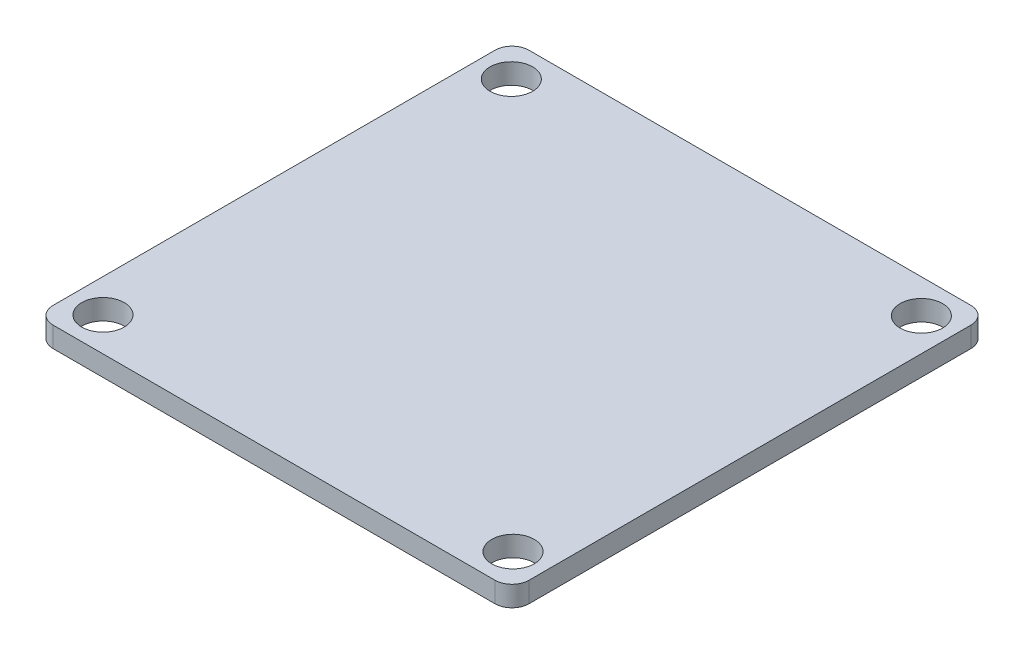
ISO-10303-21;
HEADER;
FILE_DESCRIPTION(('STEP AP214'),'2;1');
FILE_NAME('part.step','',(''),(''),'','','');
FILE_SCHEMA(('AUTOMOTIVE_DESIGN { 1 0 10303 214 1 1 1 1 }'));
ENDSEC;
DATA;
#1=APPLICATION_CONTEXT('core data for automotive mechanical design processes');
#2=APPLICATION_PROTOCOL_DEFINITION('international standard','automotive_design',2000,#1);
#3=PRODUCT_CONTEXT('',#1,'mechanical');
#4=PRODUCT('Part','Part','',(#3));
#5=PRODUCT_RELATED_PRODUCT_CATEGORY('part','',(#4));
#6=PRODUCT_DEFINITION_FORMATION('','',#4);
#7=PRODUCT_DEFINITION_CONTEXT('part definition',#1,'design');
#8=PRODUCT_DEFINITION('design','',#6,#7);
#9=PRODUCT_DEFINITION_SHAPE('','',#8);
#10=(LENGTH_UNIT() NAMED_UNIT(*) SI_UNIT(.MILLI.,.METRE.));
#11=(NAMED_UNIT(*) PLANE_ANGLE_UNIT() SI_UNIT($,.RADIAN.));
#12=(NAMED_UNIT(*) SI_UNIT($,.STERADIAN.) SOLID_ANGLE_UNIT());
#13=UNCERTAINTY_MEASURE_WITH_UNIT(LENGTH_MEASURE(1.E-05),#10,'distance_accuracy_value','');
#14=(GEOMETRIC_REPRESENTATION_CONTEXT(3) GLOBAL_UNCERTAINTY_ASSIGNED_CONTEXT((#13)) GLOBAL_UNIT_ASSIGNED_CONTEXT((#10,
#11,#12)) REPRESENTATION_CONTEXT('',''));
#15=CARTESIAN_POINT('',(0.,0.,0.));
#16=DIRECTION('',(0.,0.,1.));
#17=DIRECTION('',(1.,0.,0.));
#18=AXIS2_PLACEMENT_3D('',#15,#16,#17);
#19=CARTESIAN_POINT('',(-50.7461884856546,1.524,-34.157401308792));
#20=DIRECTION('',(0.,1.,0.));
#21=DIRECTION('',(0.,0.,1.));
#22=AXIS2_PLACEMENT_3D('',#19,#20,#21);
#23=PLANE('',#22);
#24=CARTESIAN_POINT('',(-18.9072884856546,1.524,-2.39470130879196));
#25=DIRECTION('',(0.,1.,0.));
#26=DIRECTION('',(0.,0.,-1.));
#27=AXIS2_PLACEMENT_3D('',#24,#25,#26);
#28=CIRCLE('',#27,1.5875);
#29=CARTESIAN_POINT('',(-18.9072884856546,1.524,-3.98220130879195));
#30=VERTEX_POINT('',#29);
#31=EDGE_CURVE('E188',#30,#30,#28,.T.);
#32=ORIENTED_EDGE('',*,*,#31,.F.);
#33=EDGE_LOOP('',(#32));
#34=FACE_BOUND('',#33,.T.);
#35=CARTESIAN_POINT('',(-49.5396884856546,1.524,-32.900101308792));
#36=DIRECTION('',(0.,1.,0.));
#37=DIRECTION('',(0.,0.,1.));
#38=AXIS2_PLACEMENT_3D('',#35,#36,#37);
#39=CIRCLE('',#38,1.5875);
#40=CARTESIAN_POINT('',(-49.5396884856546,1.524,-34.487601308792));
#41=VERTEX_POINT('',#40);
#42=EDGE_CURVE('E133',#41,#41,#39,.T.);
#43=ORIENTED_EDGE('',*,*,#42,.F.);
#44=EDGE_LOOP('',(#43));
#45=FACE_BOUND('',#44,.T.);
#46=CARTESIAN_POINT('',(-50.7461884856546,1.524,-34.157401308792));
#47=DIRECTION('',(0.,1.,0.));
#48=DIRECTION('',(0.,0.,1.));
#49=AXIS2_PLACEMENT_3D('',#46,#47,#48);
#50=CIRCLE('',#49,1.27);
#51=CARTESIAN_POINT('',(-50.7461884856546,1.524,-35.427401308792));
#52=VERTEX_POINT('',#51);
#53=CARTESIAN_POINT('',(-52.0161884856546,1.524,-34.1574013087919));
#54=VERTEX_POINT('',#53);
#55=EDGE_CURVE('E145',#52,#54,#50,.T.);
#56=ORIENTED_EDGE('',*,*,#55,.T.);
#57=DIRECTION('',(0.,0.,1.));
#58=VECTOR('',#57,1.);
#59=CARTESIAN_POINT('',(-52.0161884856546,1.524,-34.1574013087919));
#60=LINE('',#59,#58);
#61=CARTESIAN_POINT('',(-52.0161884856546,1.524,-1.13740130879197));
#62=VERTEX_POINT('',#61);
#63=EDGE_CURVE('E93',#54,#62,#60,.T.);
#64=ORIENTED_EDGE('',*,*,#63,.T.);
#65=CARTESIAN_POINT('',(-50.7461884856546,1.524,-1.13740130879196));
#66=DIRECTION('',(0.,1.,0.));
#67=DIRECTION('',(0.,0.,1.));
#68=AXIS2_PLACEMENT_3D('',#65,#66,#67);
#69=CIRCLE('',#68,1.27);
#70=CARTESIAN_POINT('',(-50.7461884856546,1.524,0.13259869120804));
#71=VERTEX_POINT('',#70);
#72=EDGE_CURVE('E160',#62,#71,#69,.T.);
#73=ORIENTED_EDGE('',*,*,#72,.T.);
#74=DIRECTION('',(1.,0.,0.));
#75=VECTOR('',#74,1.);
#76=CARTESIAN_POINT('',(-50.7461884856546,1.524,0.13259869120804));
#77=LINE('',#76,#75);
#78=CARTESIAN_POINT('',(-17.7261884856546,1.524,0.13259869120804));
#79=VERTEX_POINT('',#78);
#80=EDGE_CURVE('E173',#71,#79,#77,.T.);
#81=ORIENTED_EDGE('',*,*,#80,.T.);
#82=CARTESIAN_POINT('',(-17.7261884856546,1.524,-1.13740130879196));
#83=DIRECTION('',(0.,1.,0.));
#84=DIRECTION('',(0.,0.,1.));
#85=AXIS2_PLACEMENT_3D('',#82,#83,#84);
#86=CIRCLE('',#85,1.27);
#87=CARTESIAN_POINT('',(-16.4561884856546,1.524,-1.13740130879197));
#88=VERTEX_POINT('',#87);
#89=EDGE_CURVE('E112',#79,#88,#86,.T.);
#90=ORIENTED_EDGE('',*,*,#89,.T.);
#91=DIRECTION('',(0.,0.,-1.));
#92=VECTOR('',#91,1.);
#93=CARTESIAN_POINT('',(-16.4561884856546,1.524,-1.13740130879197));
#94=LINE('',#93,#92);
#95=CARTESIAN_POINT('',(-16.4561884856546,1.524,-34.1574013087919));
#96=VERTEX_POINT('',#95);
#97=EDGE_CURVE('E106',#88,#96,#94,.T.);
#98=ORIENTED_EDGE('',*,*,#97,.T.);
#99=CARTESIAN_POINT('',(-17.7261884856546,1.524,-34.157401308792));
#100=DIRECTION('',(0.,1.,0.));
#101=DIRECTION('',(0.,0.,-1.));
#102=AXIS2_PLACEMENT_3D('',#99,#100,#101);
#103=CIRCLE('',#102,1.27);
#104=CARTESIAN_POINT('',(-17.7261884856546,1.524,-35.427401308792));
#105=VERTEX_POINT('',#104);
#106=EDGE_CURVE('E110',#96,#105,#103,.T.);
#107=ORIENTED_EDGE('',*,*,#106,.T.);
#108=DIRECTION('',(-1.,0.,0.));
#109=VECTOR('',#108,1.);
#110=CARTESIAN_POINT('',(-50.7461884856546,1.524,-35.427401308792));
#111=LINE('',#110,#109);
#112=EDGE_CURVE('E50',#105,#52,#111,.T.);
#113=ORIENTED_EDGE('',*,*,#112,.T.);
#114=EDGE_LOOP('',(#56,#64,#73,#81,#90,#98,#107,#113));
#115=FACE_BOUND('',#114,.T.);
#116=CARTESIAN_POINT('',(-18.9072884856546,1.524,-32.900101308792));
#117=DIRECTION('',(0.,1.,0.));
#118=DIRECTION('',(0.,0.,1.));
#119=AXIS2_PLACEMENT_3D('',#116,#117,#118);
#120=CIRCLE('',#119,1.5875);
#121=CARTESIAN_POINT('',(-18.9072884856546,1.524,-34.487601308792));
#122=VERTEX_POINT('',#121);
#123=EDGE_CURVE('E182',#122,#122,#120,.T.);
#124=ORIENTED_EDGE('',*,*,#123,.F.);
#125=EDGE_LOOP('',(#124));
#126=FACE_BOUND('',#125,.T.);
#127=CARTESIAN_POINT('',(-49.5396884856546,1.524,-2.39470130879196));
#128=DIRECTION('',(0.,1.,0.));
#129=DIRECTION('',(0.,0.,-1.));
#130=AXIS2_PLACEMENT_3D('',#127,#128,#129);
#131=CIRCLE('',#130,1.5875);
#132=CARTESIAN_POINT('',(-49.5396884856546,1.524,-3.98220130879195));
#133=VERTEX_POINT('',#132);
#134=EDGE_CURVE('E194',#133,#133,#131,.T.);
#135=ORIENTED_EDGE('',*,*,#134,.F.);
#136=EDGE_LOOP('',(#135));
#137=FACE_BOUND('',#136,.T.);
#138=ADVANCED_FACE('F33',(#34,#45,#115,#126,#137),#23,.T.);
#139=CARTESIAN_POINT('',(-50.7461884856546,0.,-34.157401308792));
#140=DIRECTION('',(0.,1.,0.));
#141=DIRECTION('',(0.,0.,1.));
#142=AXIS2_PLACEMENT_3D('',#139,#140,#141);
#143=PLANE('',#142);
#144=CARTESIAN_POINT('',(-50.7461884856546,0.,-34.157401308792));
#145=DIRECTION('',(0.,1.,0.));
#146=DIRECTION('',(0.,0.,1.));
#147=AXIS2_PLACEMENT_3D('',#144,#145,#146);
#148=CIRCLE('',#147,1.27);
#149=CARTESIAN_POINT('',(-50.7461884856546,0.,-35.427401308792));
#150=VERTEX_POINT('',#149);
#151=CARTESIAN_POINT('',(-52.0161884856546,0.,-34.1574013087919));
#152=VERTEX_POINT('',#151);
#153=EDGE_CURVE('E129',#150,#152,#148,.T.);
#154=ORIENTED_EDGE('',*,*,#153,.F.);
#155=DIRECTION('',(-1.,0.,0.));
#156=VECTOR('',#155,1.);
#157=CARTESIAN_POINT('',(-50.7461884856546,0.,-35.427401308792));
#158=LINE('',#157,#156);
#159=CARTESIAN_POINT('',(-17.7261884856546,0.,-35.427401308792));
#160=VERTEX_POINT('',#159);
#161=EDGE_CURVE('E85',#160,#150,#158,.T.);
#162=ORIENTED_EDGE('',*,*,#161,.F.);
#163=CARTESIAN_POINT('',(-17.7261884856546,0.,-34.157401308792));
#164=DIRECTION('',(0.,1.,0.));
#165=DIRECTION('',(0.,0.,-1.));
#166=AXIS2_PLACEMENT_3D('',#163,#164,#165);
#167=CIRCLE('',#166,1.27);
#168=CARTESIAN_POINT('',(-16.4561884856546,0.,-34.1574013087919));
#169=VERTEX_POINT('',#168);
#170=EDGE_CURVE('E79',#169,#160,#167,.T.);
#171=ORIENTED_EDGE('',*,*,#170,.F.);
#172=DIRECTION('',(0.,0.,-1.));
#173=VECTOR('',#172,1.);
#174=CARTESIAN_POINT('',(-16.4561884856546,0.,-27.108901308792));
#175=LINE('',#174,#173);
#176=CARTESIAN_POINT('',(-16.4561884856546,0.,-1.13740130879197));
#177=VERTEX_POINT('',#176);
#178=EDGE_CURVE('E119',#177,#169,#175,.T.);
#179=ORIENTED_EDGE('',*,*,#178,.F.);
#180=CARTESIAN_POINT('',(-17.7261884856546,0.,-1.13740130879196));
#181=DIRECTION('',(0.,1.,0.));
#182=DIRECTION('',(0.,0.,1.));
#183=AXIS2_PLACEMENT_3D('',#180,#181,#182);
#184=CIRCLE('',#183,1.27);
#185=CARTESIAN_POINT('',(-17.7261884856546,0.,0.13259869120804));
#186=VERTEX_POINT('',#185);
#187=EDGE_CURVE('E139',#186,#177,#184,.T.);
#188=ORIENTED_EDGE('',*,*,#187,.F.);
#189=DIRECTION('',(1.,0.,0.));
#190=VECTOR('',#189,1.);
#191=CARTESIAN_POINT('',(-50.7461884856546,0.,0.13259869120804));
#192=LINE('',#191,#190);
#193=CARTESIAN_POINT('',(-50.7461884856546,0.,0.13259869120804));
#194=VERTEX_POINT('',#193);
#195=EDGE_CURVE('E137',#194,#186,#192,.T.);
#196=ORIENTED_EDGE('',*,*,#195,.F.);
#197=CARTESIAN_POINT('',(-50.7461884856546,0.,-1.13740130879196));
#198=DIRECTION('',(0.,1.,0.));
#199=DIRECTION('',(0.,0.,1.));
#200=AXIS2_PLACEMENT_3D('',#197,#198,#199);
#201=CIRCLE('',#200,1.27);
#202=CARTESIAN_POINT('',(-52.0161884856546,0.,-1.13740130879197));
#203=VERTEX_POINT('',#202);
#204=EDGE_CURVE('E135',#203,#194,#201,.T.);
#205=ORIENTED_EDGE('',*,*,#204,.F.);
#206=DIRECTION('',(0.,0.,1.));
#207=VECTOR('',#206,1.);
#208=CARTESIAN_POINT('',(-52.0161884856546,0.,-34.1574013087919));
#209=LINE('',#208,#207);
#210=EDGE_CURVE('E132',#152,#203,#209,.T.);
#211=ORIENTED_EDGE('',*,*,#210,.F.);
#212=EDGE_LOOP('',(#154,#162,#171,#179,#188,#196,#205,#211));
#213=FACE_BOUND('',#212,.T.);
#214=CARTESIAN_POINT('',(-49.5396884856546,0.,-32.900101308792));
#215=DIRECTION('',(0.,1.,0.));
#216=DIRECTION('',(0.,0.,1.));
#217=AXIS2_PLACEMENT_3D('',#214,#215,#216);
#218=CIRCLE('',#217,1.5875);
#219=CARTESIAN_POINT('',(-49.5396884856546,0.,-34.487601308792));
#220=VERTEX_POINT('',#219);
#221=EDGE_CURVE('E179',#220,#220,#218,.T.);
#222=ORIENTED_EDGE('',*,*,#221,.T.);
#223=EDGE_LOOP('',(#222));
#224=FACE_BOUND('',#223,.T.);
#225=CARTESIAN_POINT('',(-18.9072884856546,0.,-32.900101308792));
#226=DIRECTION('',(0.,1.,0.));
#227=DIRECTION('',(0.,0.,1.));
#228=AXIS2_PLACEMENT_3D('',#225,#226,#227);
#229=CIRCLE('',#228,1.5875);
#230=CARTESIAN_POINT('',(-18.9072884856546,0.,-34.487601308792));
#231=VERTEX_POINT('',#230);
#232=EDGE_CURVE('E185',#231,#231,#229,.T.);
#233=ORIENTED_EDGE('',*,*,#232,.T.);
#234=EDGE_LOOP('',(#233));
#235=FACE_BOUND('',#234,.T.);
#236=CARTESIAN_POINT('',(-18.9072884856546,0.,-2.39470130879196));
#237=DIRECTION('',(0.,1.,0.));
#238=DIRECTION('',(0.,0.,-1.));
#239=AXIS2_PLACEMENT_3D('',#236,#237,#238);
#240=CIRCLE('',#239,1.5875);
#241=CARTESIAN_POINT('',(-18.9072884856546,0.,-3.98220130879195));
#242=VERTEX_POINT('',#241);
#243=EDGE_CURVE('E191',#242,#242,#240,.T.);
#244=ORIENTED_EDGE('',*,*,#243,.T.);
#245=EDGE_LOOP('',(#244));
#246=FACE_BOUND('',#245,.T.);
#247=CARTESIAN_POINT('',(-49.5396884856546,0.,-2.39470130879196));
#248=DIRECTION('',(0.,1.,0.));
#249=DIRECTION('',(0.,0.,-1.));
#250=AXIS2_PLACEMENT_3D('',#247,#248,#249);
#251=CIRCLE('',#250,1.5875);
#252=CARTESIAN_POINT('',(-49.5396884856546,0.,-3.98220130879195));
#253=VERTEX_POINT('',#252);
#254=EDGE_CURVE('E197',#253,#253,#251,.T.);
#255=ORIENTED_EDGE('',*,*,#254,.T.);
#256=EDGE_LOOP('',(#255));
#257=FACE_BOUND('',#256,.T.);
#258=ADVANCED_FACE('F164',(#213,#224,#235,#246,#257),#143,.F.);
#259=CARTESIAN_POINT('',(-50.7461884856546,1.524,-34.157401308792));
#260=DIRECTION('',(0.,-1.,0.));
#261=DIRECTION('',(0.,0.,-1.));
#262=AXIS2_PLACEMENT_3D('',#259,#260,#261);
#263=CYLINDRICAL_SURFACE('',#262,1.27);
#264=ORIENTED_EDGE('',*,*,#153,.T.);
#265=DIRECTION('',(0.,-1.,0.));
#266=VECTOR('',#265,1.);
#267=CARTESIAN_POINT('',(-52.0161884856546,1.524,-34.1574013087919));
#268=LINE('',#267,#266);
#269=EDGE_CURVE('E11',#54,#152,#268,.T.);
#270=ORIENTED_EDGE('',*,*,#269,.F.);
#271=ORIENTED_EDGE('',*,*,#55,.F.);
#272=DIRECTION('',(0.,-1.,0.));
#273=VECTOR('',#272,1.);
#274=CARTESIAN_POINT('',(-50.7461884856546,1.524,-35.427401308792));
#275=LINE('',#274,#273);
#276=EDGE_CURVE('E125',#52,#150,#275,.T.);
#277=ORIENTED_EDGE('',*,*,#276,.T.);
#278=EDGE_LOOP('',(#264,#270,#271,#277));
#279=FACE_BOUND('',#278,.T.);
#280=ADVANCED_FACE('F35',(#279),#263,.T.);
#281=CARTESIAN_POINT('',(-52.0161884856546,1.524,-34.1574013087919));
#282=DIRECTION('',(1.,0.,0.));
#283=DIRECTION('',(0.,0.,-1.));
#284=AXIS2_PLACEMENT_3D('',#281,#282,#283);
#285=PLANE('',#284);
#286=ORIENTED_EDGE('',*,*,#210,.T.);
#287=DIRECTION('',(0.,-1.,0.));
#288=VECTOR('',#287,1.);
#289=CARTESIAN_POINT('',(-52.0161884856546,1.524,-1.13740130879197));
#290=LINE('',#289,#288);
#291=EDGE_CURVE('E42',#62,#203,#290,.T.);
#292=ORIENTED_EDGE('',*,*,#291,.F.);
#293=ORIENTED_EDGE('',*,*,#63,.F.);
#294=ORIENTED_EDGE('',*,*,#269,.T.);
#295=EDGE_LOOP('',(#286,#292,#293,#294));
#296=FACE_BOUND('',#295,.T.);
#297=ADVANCED_FACE('F231',(#296),#285,.F.);
#298=CARTESIAN_POINT('',(-50.7461884856546,1.524,-1.13740130879196));
#299=DIRECTION('',(0.,-1.,0.));
#300=DIRECTION('',(0.,0.,-1.));
#301=AXIS2_PLACEMENT_3D('',#298,#299,#300);
#302=CYLINDRICAL_SURFACE('',#301,1.27);
#303=ORIENTED_EDGE('',*,*,#204,.T.);
#304=DIRECTION('',(0.,-1.,0.));
#305=VECTOR('',#304,1.);
#306=CARTESIAN_POINT('',(-50.7461884856546,1.524,0.13259869120804));
#307=LINE('',#306,#305);
#308=EDGE_CURVE('E152',#71,#194,#307,.T.);
#309=ORIENTED_EDGE('',*,*,#308,.F.);
#310=ORIENTED_EDGE('',*,*,#72,.F.);
#311=ORIENTED_EDGE('',*,*,#291,.T.);
#312=EDGE_LOOP('',(#303,#309,#310,#311));
#313=FACE_BOUND('',#312,.T.);
#314=ADVANCED_FACE('F158',(#313),#302,.T.);
#315=CARTESIAN_POINT('',(-50.7461884856546,1.524,0.13259869120804));
#316=DIRECTION('',(0.,0.,-1.));
#317=DIRECTION('',(-1.,0.,0.));
#318=AXIS2_PLACEMENT_3D('',#315,#316,#317);
#319=PLANE('',#318);
#320=ORIENTED_EDGE('',*,*,#195,.T.);
#321=DIRECTION('',(0.,-1.,0.));
#322=VECTOR('',#321,1.);
#323=CARTESIAN_POINT('',(-17.7261884856546,1.524,0.13259869120804));
#324=LINE('',#323,#322);
#325=EDGE_CURVE('E149',#79,#186,#324,.T.);
#326=ORIENTED_EDGE('',*,*,#325,.F.);
#327=ORIENTED_EDGE('',*,*,#80,.F.);
#328=ORIENTED_EDGE('',*,*,#308,.T.);
#329=EDGE_LOOP('',(#320,#326,#327,#328));
#330=FACE_BOUND('',#329,.T.);
#331=ADVANCED_FACE('F169',(#330),#319,.F.);
#332=CARTESIAN_POINT('',(-17.7261884856546,1.524,-1.13740130879196));
#333=DIRECTION('',(0.,-1.,0.));
#334=DIRECTION('',(0.,0.,-1.));
#335=AXIS2_PLACEMENT_3D('',#332,#333,#334);
#336=CYLINDRICAL_SURFACE('',#335,1.27);
#337=ORIENTED_EDGE('',*,*,#187,.T.);
#338=DIRECTION('',(0.,-1.,0.));
#339=VECTOR('',#338,1.);
#340=CARTESIAN_POINT('',(-16.4561884856546,1.524,-1.13740130879197));
#341=LINE('',#340,#339);
#342=EDGE_CURVE('E120',#88,#177,#341,.T.);
#343=ORIENTED_EDGE('',*,*,#342,.F.);
#344=ORIENTED_EDGE('',*,*,#89,.F.);
#345=ORIENTED_EDGE('',*,*,#325,.T.);
#346=EDGE_LOOP('',(#337,#343,#344,#345));
#347=FACE_BOUND('',#346,.T.);
#348=ADVANCED_FACE('F172',(#347),#336,.T.);
#349=CARTESIAN_POINT('',(-16.4561884856546,1.524,-27.108901308792));
#350=DIRECTION('',(-1.,0.,0.));
#351=DIRECTION('',(0.,0.,1.));
#352=AXIS2_PLACEMENT_3D('',#349,#350,#351);
#353=PLANE('',#352);
#354=ORIENTED_EDGE('',*,*,#178,.T.);
#355=DIRECTION('',(0.,-1.,0.));
#356=VECTOR('',#355,1.);
#357=CARTESIAN_POINT('',(-16.4561884856546,1.524,-34.1574013087919));
#358=LINE('',#357,#356);
#359=EDGE_CURVE('E117',#96,#169,#358,.T.);
#360=ORIENTED_EDGE('',*,*,#359,.F.);
#361=ORIENTED_EDGE('',*,*,#97,.F.);
#362=ORIENTED_EDGE('',*,*,#342,.T.);
#363=EDGE_LOOP('',(#354,#360,#361,#362));
#364=FACE_BOUND('',#363,.T.);
#365=ADVANCED_FACE('F118',(#364),#353,.F.);
#366=CARTESIAN_POINT('',(-17.7261884856546,1.524,-34.157401308792));
#367=DIRECTION('',(0.,-1.,0.));
#368=DIRECTION('',(0.,0.,-1.));
#369=AXIS2_PLACEMENT_3D('',#366,#367,#368);
#370=CYLINDRICAL_SURFACE('',#369,1.27);
#371=ORIENTED_EDGE('',*,*,#170,.T.);
#372=DIRECTION('',(0.,-1.,0.));
#373=VECTOR('',#372,1.);
#374=CARTESIAN_POINT('',(-17.7261884856546,1.524,-35.427401308792));
#375=LINE('',#374,#373);
#376=EDGE_CURVE('E121',#105,#160,#375,.T.);
#377=ORIENTED_EDGE('',*,*,#376,.F.);
#378=ORIENTED_EDGE('',*,*,#106,.F.);
#379=ORIENTED_EDGE('',*,*,#359,.T.);
#380=EDGE_LOOP('',(#371,#377,#378,#379));
#381=FACE_BOUND('',#380,.T.);
#382=ADVANCED_FACE('F123',(#381),#370,.T.);
#383=CARTESIAN_POINT('',(-50.7461884856546,1.524,-35.427401308792));
#384=DIRECTION('',(0.,0.,1.));
#385=DIRECTION('',(1.,0.,0.));
#386=AXIS2_PLACEMENT_3D('',#383,#384,#385);
#387=PLANE('',#386);
#388=ORIENTED_EDGE('',*,*,#161,.T.);
#389=ORIENTED_EDGE('',*,*,#276,.F.);
#390=ORIENTED_EDGE('',*,*,#112,.F.);
#391=ORIENTED_EDGE('',*,*,#376,.T.);
#392=EDGE_LOOP('',(#388,#389,#390,#391));
#393=FACE_BOUND('',#392,.T.);
#394=ADVANCED_FACE('F219',(#393),#387,.F.);
#395=CARTESIAN_POINT('',(-49.5396884856546,1.524,-32.900101308792));
#396=DIRECTION('',(0.,-1.,0.));
#397=DIRECTION('',(0.,0.,-1.));
#398=AXIS2_PLACEMENT_3D('',#395,#396,#397);
#399=CYLINDRICAL_SURFACE('',#398,1.5875);
#400=CARTESIAN_POINT('',(-49.5396884856546,1.524,-34.487601308792));
#401=CARTESIAN_POINT('',(-49.5396884856546,1.508125,-34.487601308792));
#402=CARTESIAN_POINT('',(-49.5396884856546,1.49225,-34.487601308792));
#403=CARTESIAN_POINT('',(-49.5396884856546,1.4605,-34.487601308792));
#404=CARTESIAN_POINT('',(-49.5396884856546,1.444625,-34.487601308792));
#405=CARTESIAN_POINT('',(-49.5396884856546,1.412875,-34.487601308792));
#406=CARTESIAN_POINT('',(-49.5396884856546,1.397,-34.487601308792));
#407=CARTESIAN_POINT('',(-49.5396884856546,1.36525,-34.487601308792));
#408=CARTESIAN_POINT('',(-49.5396884856546,1.349375,-34.487601308792));
#409=CARTESIAN_POINT('',(-49.5396884856546,1.317625,-34.487601308792));
#410=CARTESIAN_POINT('',(-49.5396884856546,1.30175,-34.487601308792));
#411=CARTESIAN_POINT('',(-49.5396884856546,1.27,-34.487601308792));
#412=CARTESIAN_POINT('',(-49.5396884856546,1.254125,-34.487601308792));
#413=CARTESIAN_POINT('',(-49.5396884856546,1.222375,-34.487601308792));
#414=CARTESIAN_POINT('',(-49.5396884856546,1.2065,-34.487601308792));
#415=CARTESIAN_POINT('',(-49.5396884856546,1.17475,-34.487601308792));
#416=CARTESIAN_POINT('',(-49.5396884856546,1.158875,-34.487601308792));
#417=CARTESIAN_POINT('',(-49.5396884856546,1.127125,-34.487601308792));
#418=CARTESIAN_POINT('',(-49.5396884856546,1.11125,-34.487601308792));
#419=CARTESIAN_POINT('',(-49.5396884856546,1.0795,-34.487601308792));
#420=CARTESIAN_POINT('',(-49.5396884856546,1.063625,-34.487601308792));
#421=CARTESIAN_POINT('',(-49.5396884856546,1.031875,-34.487601308792));
#422=CARTESIAN_POINT('',(-49.5396884856546,1.016,-34.487601308792));
#423=CARTESIAN_POINT('',(-49.5396884856546,0.98425,-34.487601308792));
#424=CARTESIAN_POINT('',(-49.5396884856546,0.968375,-34.487601308792));
#425=CARTESIAN_POINT('',(-49.5396884856546,0.936625,-34.487601308792));
#426=CARTESIAN_POINT('',(-49.5396884856546,0.92075,-34.487601308792));
#427=CARTESIAN_POINT('',(-49.5396884856546,0.889,-34.487601308792));
#428=CARTESIAN_POINT('',(-49.5396884856546,0.873125,-34.487601308792));
#429=CARTESIAN_POINT('',(-49.5396884856546,0.841375,-34.487601308792));
#430=CARTESIAN_POINT('',(-49.5396884856546,0.8255,-34.487601308792));
#431=CARTESIAN_POINT('',(-49.5396884856546,0.79375,-34.487601308792));
#432=CARTESIAN_POINT('',(-49.5396884856546,0.777875,-34.487601308792));
#433=CARTESIAN_POINT('',(-49.5396884856546,0.746125,-34.487601308792));
#434=CARTESIAN_POINT('',(-49.5396884856546,0.73025,-34.487601308792));
#435=CARTESIAN_POINT('',(-49.5396884856546,0.6985,-34.487601308792));
#436=CARTESIAN_POINT('',(-49.5396884856546,0.682625,-34.487601308792));
#437=CARTESIAN_POINT('',(-49.5396884856546,0.650875,-34.487601308792));
#438=CARTESIAN_POINT('',(-49.5396884856546,0.635,-34.487601308792));
#439=CARTESIAN_POINT('',(-49.5396884856546,0.60325,-34.487601308792));
#440=CARTESIAN_POINT('',(-49.5396884856546,0.587375,-34.487601308792));
#441=CARTESIAN_POINT('',(-49.5396884856546,0.555625,-34.487601308792));
#442=CARTESIAN_POINT('',(-49.5396884856546,0.53975,-34.487601308792));
#443=CARTESIAN_POINT('',(-49.5396884856546,0.508,-34.487601308792));
#444=CARTESIAN_POINT('',(-49.5396884856546,0.492125,-34.487601308792));
#445=CARTESIAN_POINT('',(-49.5396884856546,0.460375,-34.487601308792));
#446=CARTESIAN_POINT('',(-49.5396884856546,0.4445,-34.487601308792));
#447=CARTESIAN_POINT('',(-49.5396884856546,0.41275,-34.487601308792));
#448=CARTESIAN_POINT('',(-49.5396884856546,0.396875,-34.487601308792));
#449=CARTESIAN_POINT('',(-49.5396884856546,0.365125,-34.487601308792));
#450=CARTESIAN_POINT('',(-49.5396884856546,0.34925,-34.487601308792));
#451=CARTESIAN_POINT('',(-49.5396884856546,0.3175,-34.487601308792));
#452=CARTESIAN_POINT('',(-49.5396884856546,0.301625,-34.487601308792));
#453=CARTESIAN_POINT('',(-49.5396884856546,0.269875,-34.487601308792));
#454=CARTESIAN_POINT('',(-49.5396884856546,0.254,-34.487601308792));
#455=CARTESIAN_POINT('',(-49.5396884856546,0.22225,-34.487601308792));
#456=CARTESIAN_POINT('',(-49.5396884856546,0.206375,-34.487601308792));
#457=CARTESIAN_POINT('',(-49.5396884856546,0.174625,-34.487601308792));
#458=CARTESIAN_POINT('',(-49.5396884856546,0.15875,-34.487601308792));
#459=CARTESIAN_POINT('',(-49.5396884856546,0.127,-34.487601308792));
#460=CARTESIAN_POINT('',(-49.5396884856546,0.111125,-34.487601308792));
#461=CARTESIAN_POINT('',(-49.5396884856546,0.079375,-34.487601308792));
#462=CARTESIAN_POINT('',(-49.5396884856546,0.0635,-34.487601308792));
#463=CARTESIAN_POINT('',(-49.5396884856546,0.0317499999999999,-34.487601308792));
#464=CARTESIAN_POINT('',(-49.5396884856546,0.015875,-34.487601308792));
#465=CARTESIAN_POINT('',(-49.5396884856546,0.,-34.487601308792));
#466=B_SPLINE_CURVE_WITH_KNOTS('',3,(#400,#401,#402,#403,#404,#405,#406,#407,#408,#409,#410,
#411,#412,#413,#414,#415,#416,#417,#418,#419,#420,#421,#422,#423,#424,#425,#426,#427,#428,#429,
#430,#431,#432,#433,#434,#435,#436,#437,#438,#439,#440,#441,#442,#443,#444,#445,#446,#447,#448,
#449,#450,#451,#452,#453,#454,#455,#456,#457,#458,#459,#460,#461,#462,#463,#464,#465),
.UNSPECIFIED.,.F.,.F.,(4,2,2,2,2,2,2,2,2,2,2,2,2,2,2,2,2,2,2,2,2,2,2,2,2,2,2,2,2,2,2,2,4),(0.,
0.0476250000000001,0.0952500000000001,0.142875,0.1905,0.238125,0.28575,0.333375,0.381,0.428625,
0.47625,0.523875,0.5715,0.619125,0.66675,0.714375,0.762,0.809625,0.85725,0.904875,0.9525,
1.000125,1.04775,1.095375,1.143,1.190625,1.23825,1.285875,1.3335,1.381125,1.42875,1.476375,
1.524),.UNSPECIFIED.);
#467=EDGE_CURVE('BSEAM216',#41,#220,#466,.T.);
#468=ORIENTED_EDGE('',*,*,#42,.T.);
#469=ORIENTED_EDGE('',*,*,#221,.F.);
#470=ORIENTED_EDGE('',*,*,#467,.T.);
#471=ORIENTED_EDGE('',*,*,#467,.F.);
#472=EDGE_LOOP('',(#468,#470,#469,#471));
#473=FACE_BOUND('',#472,.T.);
#474=ADVANCED_FACE('F216',(#473),#399,.F.);
#475=CARTESIAN_POINT('',(-18.9072884856546,1.524,-32.900101308792));
#476=DIRECTION('',(0.,-1.,0.));
#477=DIRECTION('',(0.,0.,-1.));
#478=AXIS2_PLACEMENT_3D('',#475,#476,#477);
#479=CYLINDRICAL_SURFACE('',#478,1.5875);
#480=CARTESIAN_POINT('',(-18.9072884856546,1.524,-34.487601308792));
#481=CARTESIAN_POINT('',(-18.9072884856546,1.508125,-34.487601308792));
#482=CARTESIAN_POINT('',(-18.9072884856546,1.49225,-34.487601308792));
#483=CARTESIAN_POINT('',(-18.9072884856546,1.4605,-34.487601308792));
#484=CARTESIAN_POINT('',(-18.9072884856546,1.444625,-34.487601308792));
#485=CARTESIAN_POINT('',(-18.9072884856546,1.412875,-34.487601308792));
#486=CARTESIAN_POINT('',(-18.9072884856546,1.397,-34.487601308792));
#487=CARTESIAN_POINT('',(-18.9072884856546,1.36525,-34.487601308792));
#488=CARTESIAN_POINT('',(-18.9072884856546,1.349375,-34.487601308792));
#489=CARTESIAN_POINT('',(-18.9072884856546,1.317625,-34.487601308792));
#490=CARTESIAN_POINT('',(-18.9072884856546,1.30175,-34.487601308792));
#491=CARTESIAN_POINT('',(-18.9072884856546,1.27,-34.487601308792));
#492=CARTESIAN_POINT('',(-18.9072884856546,1.254125,-34.487601308792));
#493=CARTESIAN_POINT('',(-18.9072884856546,1.222375,-34.487601308792));
#494=CARTESIAN_POINT('',(-18.9072884856546,1.2065,-34.487601308792));
#495=CARTESIAN_POINT('',(-18.9072884856546,1.17475,-34.487601308792));
#496=CARTESIAN_POINT('',(-18.9072884856546,1.158875,-34.487601308792));
#497=CARTESIAN_POINT('',(-18.9072884856546,1.127125,-34.487601308792));
#498=CARTESIAN_POINT('',(-18.9072884856546,1.11125,-34.487601308792));
#499=CARTESIAN_POINT('',(-18.9072884856546,1.0795,-34.487601308792));
#500=CARTESIAN_POINT('',(-18.9072884856546,1.063625,-34.487601308792));
#501=CARTESIAN_POINT('',(-18.9072884856546,1.031875,-34.487601308792));
#502=CARTESIAN_POINT('',(-18.9072884856546,1.016,-34.487601308792));
#503=CARTESIAN_POINT('',(-18.9072884856546,0.98425,-34.487601308792));
#504=CARTESIAN_POINT('',(-18.9072884856546,0.968375,-34.487601308792));
#505=CARTESIAN_POINT('',(-18.9072884856546,0.936625,-34.487601308792));
#506=CARTESIAN_POINT('',(-18.9072884856546,0.92075,-34.487601308792));
#507=CARTESIAN_POINT('',(-18.9072884856546,0.889,-34.487601308792));
#508=CARTESIAN_POINT('',(-18.9072884856546,0.873125,-34.487601308792));
#509=CARTESIAN_POINT('',(-18.9072884856546,0.841375,-34.487601308792));
#510=CARTESIAN_POINT('',(-18.9072884856546,0.8255,-34.487601308792));
#511=CARTESIAN_POINT('',(-18.9072884856546,0.79375,-34.487601308792));
#512=CARTESIAN_POINT('',(-18.9072884856546,0.777875,-34.487601308792));
#513=CARTESIAN_POINT('',(-18.9072884856546,0.746125,-34.487601308792));
#514=CARTESIAN_POINT('',(-18.9072884856546,0.73025,-34.487601308792));
#515=CARTESIAN_POINT('',(-18.9072884856546,0.6985,-34.487601308792));
#516=CARTESIAN_POINT('',(-18.9072884856546,0.682625,-34.487601308792));
#517=CARTESIAN_POINT('',(-18.9072884856546,0.650875,-34.487601308792));
#518=CARTESIAN_POINT('',(-18.9072884856546,0.635,-34.487601308792));
#519=CARTESIAN_POINT('',(-18.9072884856546,0.60325,-34.487601308792));
#520=CARTESIAN_POINT('',(-18.9072884856546,0.587375,-34.487601308792));
#521=CARTESIAN_POINT('',(-18.9072884856546,0.555625,-34.487601308792));
#522=CARTESIAN_POINT('',(-18.9072884856546,0.53975,-34.487601308792));
#523=CARTESIAN_POINT('',(-18.9072884856546,0.508,-34.487601308792));
#524=CARTESIAN_POINT('',(-18.9072884856546,0.492125,-34.487601308792));
#525=CARTESIAN_POINT('',(-18.9072884856546,0.460375,-34.487601308792));
#526=CARTESIAN_POINT('',(-18.9072884856546,0.4445,-34.487601308792));
#527=CARTESIAN_POINT('',(-18.9072884856546,0.41275,-34.487601308792));
#528=CARTESIAN_POINT('',(-18.9072884856546,0.396875,-34.487601308792));
#529=CARTESIAN_POINT('',(-18.9072884856546,0.365125,-34.487601308792));
#530=CARTESIAN_POINT('',(-18.9072884856546,0.34925,-34.487601308792));
#531=CARTESIAN_POINT('',(-18.9072884856546,0.3175,-34.487601308792));
#532=CARTESIAN_POINT('',(-18.9072884856546,0.301625,-34.487601308792));
#533=CARTESIAN_POINT('',(-18.9072884856546,0.269875,-34.487601308792));
#534=CARTESIAN_POINT('',(-18.9072884856546,0.254,-34.487601308792));
#535=CARTESIAN_POINT('',(-18.9072884856546,0.22225,-34.487601308792));
#536=CARTESIAN_POINT('',(-18.9072884856546,0.206375,-34.487601308792));
#537=CARTESIAN_POINT('',(-18.9072884856546,0.174625,-34.487601308792));
#538=CARTESIAN_POINT('',(-18.9072884856546,0.15875,-34.487601308792));
#539=CARTESIAN_POINT('',(-18.9072884856546,0.127,-34.487601308792));
#540=CARTESIAN_POINT('',(-18.9072884856546,0.111125,-34.487601308792));
#541=CARTESIAN_POINT('',(-18.9072884856546,0.079375,-34.487601308792));
#542=CARTESIAN_POINT('',(-18.9072884856546,0.0635,-34.487601308792));
#543=CARTESIAN_POINT('',(-18.9072884856546,0.0317499999999999,-34.487601308792));
#544=CARTESIAN_POINT('',(-18.9072884856546,0.015875,-34.487601308792));
#545=CARTESIAN_POINT('',(-18.9072884856546,0.,-34.487601308792));
#546=B_SPLINE_CURVE_WITH_KNOTS('',3,(#480,#481,#482,#483,#484,#485,#486,#487,#488,#489,#490,
#491,#492,#493,#494,#495,#496,#497,#498,#499,#500,#501,#502,#503,#504,#505,#506,#507,#508,#509,
#510,#511,#512,#513,#514,#515,#516,#517,#518,#519,#520,#521,#522,#523,#524,#525,#526,#527,#528,
#529,#530,#531,#532,#533,#534,#535,#536,#537,#538,#539,#540,#541,#542,#543,#544,#545),
.UNSPECIFIED.,.F.,.F.,(4,2,2,2,2,2,2,2,2,2,2,2,2,2,2,2,2,2,2,2,2,2,2,2,2,2,2,2,2,2,2,2,4),(0.,
0.0476250000000001,0.0952500000000001,0.142875,0.1905,0.238125,0.28575,0.333375,0.381,0.428625,
0.47625,0.523875,0.5715,0.619125,0.66675,0.714375,0.762,0.809625,0.85725,0.904875,0.9525,
1.000125,1.04775,1.095375,1.143,1.190625,1.23825,1.285875,1.3335,1.381125,1.42875,1.476375,
1.524),.UNSPECIFIED.);
#547=EDGE_CURVE('BSEAM301',#122,#231,#546,.T.);
#548=ORIENTED_EDGE('',*,*,#123,.T.);
#549=ORIENTED_EDGE('',*,*,#232,.F.);
#550=ORIENTED_EDGE('',*,*,#547,.T.);
#551=ORIENTED_EDGE('',*,*,#547,.F.);
#552=EDGE_LOOP('',(#548,#550,#549,#551));
#553=FACE_BOUND('',#552,.T.);
#554=ADVANCED_FACE('F301',(#553),#479,.F.);
#555=CARTESIAN_POINT('',(-18.9072884856546,1.524,-2.39470130879196));
#556=DIRECTION('',(0.,-1.,0.));
#557=DIRECTION('',(0.,0.,-1.));
#558=AXIS2_PLACEMENT_3D('',#555,#556,#557);
#559=CYLINDRICAL_SURFACE('',#558,1.5875);
#560=CARTESIAN_POINT('',(-18.9072884856546,1.524,-3.98220130879195));
#561=CARTESIAN_POINT('',(-18.9072884856546,1.508125,-3.98220130879195));
#562=CARTESIAN_POINT('',(-18.9072884856546,1.49225,-3.98220130879195));
#563=CARTESIAN_POINT('',(-18.9072884856546,1.4605,-3.98220130879195));
#564=CARTESIAN_POINT('',(-18.9072884856546,1.444625,-3.98220130879195));
#565=CARTESIAN_POINT('',(-18.9072884856546,1.412875,-3.98220130879195));
#566=CARTESIAN_POINT('',(-18.9072884856546,1.397,-3.98220130879195));
#567=CARTESIAN_POINT('',(-18.9072884856546,1.36525,-3.98220130879195));
#568=CARTESIAN_POINT('',(-18.9072884856546,1.349375,-3.98220130879195));
#569=CARTESIAN_POINT('',(-18.9072884856546,1.317625,-3.98220130879195));
#570=CARTESIAN_POINT('',(-18.9072884856546,1.30175,-3.98220130879195));
#571=CARTESIAN_POINT('',(-18.9072884856546,1.27,-3.98220130879195));
#572=CARTESIAN_POINT('',(-18.9072884856546,1.254125,-3.98220130879195));
#573=CARTESIAN_POINT('',(-18.9072884856546,1.222375,-3.98220130879195));
#574=CARTESIAN_POINT('',(-18.9072884856546,1.2065,-3.98220130879195));
#575=CARTESIAN_POINT('',(-18.9072884856546,1.17475,-3.98220130879195));
#576=CARTESIAN_POINT('',(-18.9072884856546,1.158875,-3.98220130879195));
#577=CARTESIAN_POINT('',(-18.9072884856546,1.127125,-3.98220130879195));
#578=CARTESIAN_POINT('',(-18.9072884856546,1.11125,-3.98220130879195));
#579=CARTESIAN_POINT('',(-18.9072884856546,1.0795,-3.98220130879195));
#580=CARTESIAN_POINT('',(-18.9072884856546,1.063625,-3.98220130879195));
#581=CARTESIAN_POINT('',(-18.9072884856546,1.031875,-3.98220130879195));
#582=CARTESIAN_POINT('',(-18.9072884856546,1.016,-3.98220130879195));
#583=CARTESIAN_POINT('',(-18.9072884856546,0.98425,-3.98220130879195));
#584=CARTESIAN_POINT('',(-18.9072884856546,0.968375,-3.98220130879195));
#585=CARTESIAN_POINT('',(-18.9072884856546,0.936625,-3.98220130879195));
#586=CARTESIAN_POINT('',(-18.9072884856546,0.92075,-3.98220130879195));
#587=CARTESIAN_POINT('',(-18.9072884856546,0.889,-3.98220130879195));
#588=CARTESIAN_POINT('',(-18.9072884856546,0.873125,-3.98220130879195));
#589=CARTESIAN_POINT('',(-18.9072884856546,0.841375,-3.98220130879195));
#590=CARTESIAN_POINT('',(-18.9072884856546,0.8255,-3.98220130879195));
#591=CARTESIAN_POINT('',(-18.9072884856546,0.79375,-3.98220130879195));
#592=CARTESIAN_POINT('',(-18.9072884856546,0.777875,-3.98220130879195));
#593=CARTESIAN_POINT('',(-18.9072884856546,0.746125,-3.98220130879195));
#594=CARTESIAN_POINT('',(-18.9072884856546,0.73025,-3.98220130879195));
#595=CARTESIAN_POINT('',(-18.9072884856546,0.6985,-3.98220130879195));
#596=CARTESIAN_POINT('',(-18.9072884856546,0.682625,-3.98220130879195));
#597=CARTESIAN_POINT('',(-18.9072884856546,0.650875,-3.98220130879195));
#598=CARTESIAN_POINT('',(-18.9072884856546,0.635,-3.98220130879195));
#599=CARTESIAN_POINT('',(-18.9072884856546,0.60325,-3.98220130879195));
#600=CARTESIAN_POINT('',(-18.9072884856546,0.587375,-3.98220130879195));
#601=CARTESIAN_POINT('',(-18.9072884856546,0.555625,-3.98220130879195));
#602=CARTESIAN_POINT('',(-18.9072884856546,0.53975,-3.98220130879195));
#603=CARTESIAN_POINT('',(-18.9072884856546,0.508,-3.98220130879195));
#604=CARTESIAN_POINT('',(-18.9072884856546,0.492125,-3.98220130879195));
#605=CARTESIAN_POINT('',(-18.9072884856546,0.460375,-3.98220130879195));
#606=CARTESIAN_POINT('',(-18.9072884856546,0.4445,-3.98220130879195));
#607=CARTESIAN_POINT('',(-18.9072884856546,0.41275,-3.98220130879195));
#608=CARTESIAN_POINT('',(-18.9072884856546,0.396875,-3.98220130879195));
#609=CARTESIAN_POINT('',(-18.9072884856546,0.365125,-3.98220130879195));
#610=CARTESIAN_POINT('',(-18.9072884856546,0.34925,-3.98220130879195));
#611=CARTESIAN_POINT('',(-18.9072884856546,0.3175,-3.98220130879195));
#612=CARTESIAN_POINT('',(-18.9072884856546,0.301625,-3.98220130879195));
#613=CARTESIAN_POINT('',(-18.9072884856546,0.269875,-3.98220130879195));
#614=CARTESIAN_POINT('',(-18.9072884856546,0.254,-3.98220130879195));
#615=CARTESIAN_POINT('',(-18.9072884856546,0.22225,-3.98220130879195));
#616=CARTESIAN_POINT('',(-18.9072884856546,0.206375,-3.98220130879195));
#617=CARTESIAN_POINT('',(-18.9072884856546,0.174625,-3.98220130879195));
#618=CARTESIAN_POINT('',(-18.9072884856546,0.15875,-3.98220130879195));
#619=CARTESIAN_POINT('',(-18.9072884856546,0.127,-3.98220130879195));
#620=CARTESIAN_POINT('',(-18.9072884856546,0.111125,-3.98220130879195));
#621=CARTESIAN_POINT('',(-18.9072884856546,0.079375,-3.98220130879195));
#622=CARTESIAN_POINT('',(-18.9072884856546,0.0635,-3.98220130879195));
#623=CARTESIAN_POINT('',(-18.9072884856546,0.0317499999999999,-3.98220130879195));
#624=CARTESIAN_POINT('',(-18.9072884856546,0.015875,-3.98220130879195));
#625=CARTESIAN_POINT('',(-18.9072884856546,0.,-3.98220130879195));
#626=B_SPLINE_CURVE_WITH_KNOTS('',3,(#560,#561,#562,#563,#564,#565,#566,#567,#568,#569,#570,
#571,#572,#573,#574,#575,#576,#577,#578,#579,#580,#581,#582,#583,#584,#585,#586,#587,#588,#589,
#590,#591,#592,#593,#594,#595,#596,#597,#598,#599,#600,#601,#602,#603,#604,#605,#606,#607,#608,
#609,#610,#611,#612,#613,#614,#615,#616,#617,#618,#619,#620,#621,#622,#623,#624,#625),
.UNSPECIFIED.,.F.,.F.,(4,2,2,2,2,2,2,2,2,2,2,2,2,2,2,2,2,2,2,2,2,2,2,2,2,2,2,2,2,2,2,2,4),(0.,
0.0476250000000001,0.0952500000000001,0.142875,0.1905,0.238125,0.28575,0.333375,0.381,0.428625,
0.47625,0.523875,0.5715,0.619125,0.66675,0.714375,0.762,0.809625,0.85725,0.904875,0.9525,
1.000125,1.04775,1.095375,1.143,1.190625,1.23825,1.285875,1.3335,1.381125,1.42875,1.476375,
1.524),.UNSPECIFIED.);
#627=EDGE_CURVE('BSEAM309',#30,#242,#626,.T.);
#628=ORIENTED_EDGE('',*,*,#31,.T.);
#629=ORIENTED_EDGE('',*,*,#243,.F.);
#630=ORIENTED_EDGE('',*,*,#627,.T.);
#631=ORIENTED_EDGE('',*,*,#627,.F.);
#632=EDGE_LOOP('',(#628,#630,#629,#631));
#633=FACE_BOUND('',#632,.T.);
#634=ADVANCED_FACE('F309',(#633),#559,.F.);
#635=CARTESIAN_POINT('',(-49.5396884856546,1.524,-2.39470130879196));
#636=DIRECTION('',(0.,-1.,0.));
#637=DIRECTION('',(0.,0.,-1.));
#638=AXIS2_PLACEMENT_3D('',#635,#636,#637);
#639=CYLINDRICAL_SURFACE('',#638,1.5875);
#640=CARTESIAN_POINT('',(-49.5396884856546,1.524,-3.98220130879195));
#641=CARTESIAN_POINT('',(-49.5396884856546,1.508125,-3.98220130879195));
#642=CARTESIAN_POINT('',(-49.5396884856546,1.49225,-3.98220130879195));
#643=CARTESIAN_POINT('',(-49.5396884856546,1.4605,-3.98220130879195));
#644=CARTESIAN_POINT('',(-49.5396884856546,1.444625,-3.98220130879195));
#645=CARTESIAN_POINT('',(-49.5396884856546,1.412875,-3.98220130879195));
#646=CARTESIAN_POINT('',(-49.5396884856546,1.397,-3.98220130879195));
#647=CARTESIAN_POINT('',(-49.5396884856546,1.36525,-3.98220130879195));
#648=CARTESIAN_POINT('',(-49.5396884856546,1.349375,-3.98220130879195));
#649=CARTESIAN_POINT('',(-49.5396884856546,1.317625,-3.98220130879195));
#650=CARTESIAN_POINT('',(-49.5396884856546,1.30175,-3.98220130879195));
#651=CARTESIAN_POINT('',(-49.5396884856546,1.27,-3.98220130879195));
#652=CARTESIAN_POINT('',(-49.5396884856546,1.254125,-3.98220130879195));
#653=CARTESIAN_POINT('',(-49.5396884856546,1.222375,-3.98220130879195));
#654=CARTESIAN_POINT('',(-49.5396884856546,1.2065,-3.98220130879195));
#655=CARTESIAN_POINT('',(-49.5396884856546,1.17475,-3.98220130879195));
#656=CARTESIAN_POINT('',(-49.5396884856546,1.158875,-3.98220130879195));
#657=CARTESIAN_POINT('',(-49.5396884856546,1.127125,-3.98220130879195));
#658=CARTESIAN_POINT('',(-49.5396884856546,1.11125,-3.98220130879195));
#659=CARTESIAN_POINT('',(-49.5396884856546,1.0795,-3.98220130879195));
#660=CARTESIAN_POINT('',(-49.5396884856546,1.063625,-3.98220130879195));
#661=CARTESIAN_POINT('',(-49.5396884856546,1.031875,-3.98220130879195));
#662=CARTESIAN_POINT('',(-49.5396884856546,1.016,-3.98220130879195));
#663=CARTESIAN_POINT('',(-49.5396884856546,0.98425,-3.98220130879195));
#664=CARTESIAN_POINT('',(-49.5396884856546,0.968375,-3.98220130879195));
#665=CARTESIAN_POINT('',(-49.5396884856546,0.936625,-3.98220130879195));
#666=CARTESIAN_POINT('',(-49.5396884856546,0.92075,-3.98220130879195));
#667=CARTESIAN_POINT('',(-49.5396884856546,0.889,-3.98220130879195));
#668=CARTESIAN_POINT('',(-49.5396884856546,0.873125,-3.98220130879195));
#669=CARTESIAN_POINT('',(-49.5396884856546,0.841375,-3.98220130879195));
#670=CARTESIAN_POINT('',(-49.5396884856546,0.8255,-3.98220130879195));
#671=CARTESIAN_POINT('',(-49.5396884856546,0.79375,-3.98220130879195));
#672=CARTESIAN_POINT('',(-49.5396884856546,0.777875,-3.98220130879195));
#673=CARTESIAN_POINT('',(-49.5396884856546,0.746125,-3.98220130879195));
#674=CARTESIAN_POINT('',(-49.5396884856546,0.73025,-3.98220130879195));
#675=CARTESIAN_POINT('',(-49.5396884856546,0.6985,-3.98220130879195));
#676=CARTESIAN_POINT('',(-49.5396884856546,0.682625,-3.98220130879195));
#677=CARTESIAN_POINT('',(-49.5396884856546,0.650875,-3.98220130879195));
#678=CARTESIAN_POINT('',(-49.5396884856546,0.635,-3.98220130879195));
#679=CARTESIAN_POINT('',(-49.5396884856546,0.60325,-3.98220130879195));
#680=CARTESIAN_POINT('',(-49.5396884856546,0.587375,-3.98220130879195));
#681=CARTESIAN_POINT('',(-49.5396884856546,0.555625,-3.98220130879195));
#682=CARTESIAN_POINT('',(-49.5396884856546,0.53975,-3.98220130879195));
#683=CARTESIAN_POINT('',(-49.5396884856546,0.508,-3.98220130879195));
#684=CARTESIAN_POINT('',(-49.5396884856546,0.492125,-3.98220130879195));
#685=CARTESIAN_POINT('',(-49.5396884856546,0.460375,-3.98220130879195));
#686=CARTESIAN_POINT('',(-49.5396884856546,0.4445,-3.98220130879195));
#687=CARTESIAN_POINT('',(-49.5396884856546,0.41275,-3.98220130879195));
#688=CARTESIAN_POINT('',(-49.5396884856546,0.396875,-3.98220130879195));
#689=CARTESIAN_POINT('',(-49.5396884856546,0.365125,-3.98220130879195));
#690=CARTESIAN_POINT('',(-49.5396884856546,0.34925,-3.98220130879195));
#691=CARTESIAN_POINT('',(-49.5396884856546,0.3175,-3.98220130879195));
#692=CARTESIAN_POINT('',(-49.5396884856546,0.301625,-3.98220130879195));
#693=CARTESIAN_POINT('',(-49.5396884856546,0.269875,-3.98220130879195));
#694=CARTESIAN_POINT('',(-49.5396884856546,0.254,-3.98220130879195));
#695=CARTESIAN_POINT('',(-49.5396884856546,0.22225,-3.98220130879195));
#696=CARTESIAN_POINT('',(-49.5396884856546,0.206375,-3.98220130879195));
#697=CARTESIAN_POINT('',(-49.5396884856546,0.174625,-3.98220130879195));
#698=CARTESIAN_POINT('',(-49.5396884856546,0.15875,-3.98220130879195));
#699=CARTESIAN_POINT('',(-49.5396884856546,0.127,-3.98220130879195));
#700=CARTESIAN_POINT('',(-49.5396884856546,0.111125,-3.98220130879195));
#701=CARTESIAN_POINT('',(-49.5396884856546,0.079375,-3.98220130879195));
#702=CARTESIAN_POINT('',(-49.5396884856546,0.0635,-3.98220130879195));
#703=CARTESIAN_POINT('',(-49.5396884856546,0.0317499999999999,-3.98220130879195));
#704=CARTESIAN_POINT('',(-49.5396884856546,0.015875,-3.98220130879195));
#705=CARTESIAN_POINT('',(-49.5396884856546,0.,-3.98220130879195));
#706=B_SPLINE_CURVE_WITH_KNOTS('',3,(#640,#641,#642,#643,#644,#645,#646,#647,#648,#649,#650,
#651,#652,#653,#654,#655,#656,#657,#658,#659,#660,#661,#662,#663,#664,#665,#666,#667,#668,#669,
#670,#671,#672,#673,#674,#675,#676,#677,#678,#679,#680,#681,#682,#683,#684,#685,#686,#687,#688,
#689,#690,#691,#692,#693,#694,#695,#696,#697,#698,#699,#700,#701,#702,#703,#704,#705),
.UNSPECIFIED.,.F.,.F.,(4,2,2,2,2,2,2,2,2,2,2,2,2,2,2,2,2,2,2,2,2,2,2,2,2,2,2,2,2,2,2,2,4),(0.,
0.0476250000000001,0.0952500000000001,0.142875,0.1905,0.238125,0.28575,0.333375,0.381,0.428625,
0.47625,0.523875,0.5715,0.619125,0.66675,0.714375,0.762,0.809625,0.85725,0.904875,0.9525,
1.000125,1.04775,1.095375,1.143,1.190625,1.23825,1.285875,1.3335,1.381125,1.42875,1.476375,
1.524),.UNSPECIFIED.);
#707=EDGE_CURVE('BSEAM203',#133,#253,#706,.T.);
#708=ORIENTED_EDGE('',*,*,#134,.T.);
#709=ORIENTED_EDGE('',*,*,#254,.F.);
#710=ORIENTED_EDGE('',*,*,#707,.T.);
#711=ORIENTED_EDGE('',*,*,#707,.F.);
#712=EDGE_LOOP('',(#708,#710,#709,#711));
#713=FACE_BOUND('',#712,.T.);
#714=ADVANCED_FACE('F203',(#713),#639,.F.);
#715=CLOSED_SHELL('',(#138,#258,#280,#297,#314,#331,#348,#365,#382,#394,#474,#554,#634,#714));
#716=MANIFOLD_SOLID_BREP('B2',#715);
#717=ADVANCED_BREP_SHAPE_REPRESENTATION('',(#18,#716),#14);
#718=SHAPE_DEFINITION_REPRESENTATION(#9,#717);
ENDSEC;
END-ISO-10303-21;
